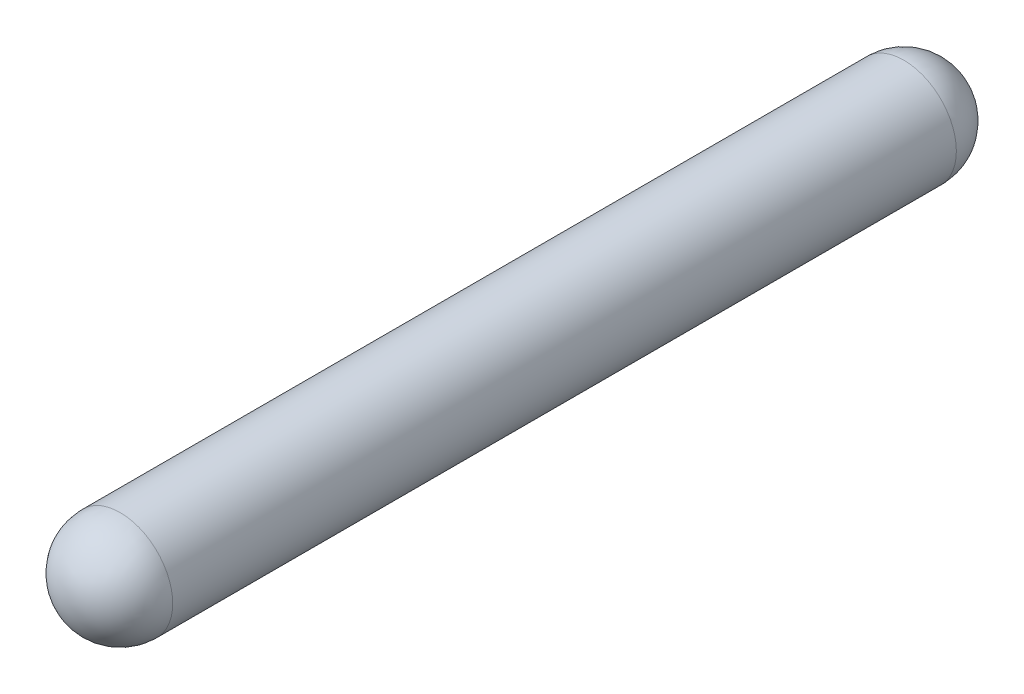
ISO-10303-21;
HEADER;
FILE_DESCRIPTION(('STEP AP214'),'2;1');
FILE_NAME('part.step','',(''),(''),'','','');
FILE_SCHEMA(('AUTOMOTIVE_DESIGN { 1 0 10303 214 1 1 1 1 }'));
ENDSEC;
DATA;
#1=APPLICATION_CONTEXT('core data for automotive mechanical design processes');
#2=APPLICATION_PROTOCOL_DEFINITION('international standard','automotive_design',2000,#1);
#3=PRODUCT_CONTEXT('',#1,'mechanical');
#4=PRODUCT('Part','Part','',(#3));
#5=PRODUCT_RELATED_PRODUCT_CATEGORY('part','',(#4));
#6=PRODUCT_DEFINITION_FORMATION('','',#4);
#7=PRODUCT_DEFINITION_CONTEXT('part definition',#1,'design');
#8=PRODUCT_DEFINITION('design','',#6,#7);
#9=PRODUCT_DEFINITION_SHAPE('','',#8);
#10=(LENGTH_UNIT() NAMED_UNIT(*) SI_UNIT(.MILLI.,.METRE.));
#11=(NAMED_UNIT(*) PLANE_ANGLE_UNIT() SI_UNIT($,.RADIAN.));
#12=(NAMED_UNIT(*) SI_UNIT($,.STERADIAN.) SOLID_ANGLE_UNIT());
#13=UNCERTAINTY_MEASURE_WITH_UNIT(LENGTH_MEASURE(1.E-05),#10,'distance_accuracy_value','');
#14=(GEOMETRIC_REPRESENTATION_CONTEXT(3) GLOBAL_UNCERTAINTY_ASSIGNED_CONTEXT((#13)) GLOBAL_UNIT_ASSIGNED_CONTEXT((#10,
#11,#12)) REPRESENTATION_CONTEXT('',''));
#15=CARTESIAN_POINT('',(0.,0.,0.));
#16=DIRECTION('',(0.,0.,1.));
#17=DIRECTION('',(1.,0.,0.));
#18=AXIS2_PLACEMENT_3D('',#15,#16,#17);
#19=CARTESIAN_POINT('',(-8.001,-11.811,-3.));
#20=DIRECTION('',(1.,0.,0.));
#21=DIRECTION('',(0.,-1.,0.));
#22=AXIS2_PLACEMENT_3D('',#19,#20,#21);
#23=SPHERICAL_SURFACE('',#22,0.7374);
#24=CARTESIAN_POINT('',(-8.001,-11.811,-3.));
#25=DIRECTION('',(0.,0.,1.));
#26=DIRECTION('',(1.,0.,0.));
#27=AXIS2_PLACEMENT_3D('',#24,#25,#26);
#28=CIRCLE('',#27,0.7374);
#29=CARTESIAN_POINT('',(-7.2636,-11.811,-3.));
#30=VERTEX_POINT('',#29);
#31=CARTESIAN_POINT('',(-8.7384,-11.811,-3.));
#32=VERTEX_POINT('',#31);
#33=EDGE_CURVE('E42',#30,#32,#28,.T.);
#34=ORIENTED_EDGE('',*,*,#33,.F.);
#35=CARTESIAN_POINT('',(-8.001,-11.811,-3.));
#36=DIRECTION('',(0.,0.,1.));
#37=DIRECTION('',(1.,0.,0.));
#38=AXIS2_PLACEMENT_3D('',#35,#36,#37);
#39=CIRCLE('',#38,0.7374);
#40=EDGE_CURVE('E26',#32,#30,#39,.T.);
#41=ORIENTED_EDGE('',*,*,#40,.F.);
#42=EDGE_LOOP('',(#34,#41));
#43=FACE_BOUND('',#42,.T.);
#44=ADVANCED_FACE('F17',(#43),#23,.T.);
#45=CARTESIAN_POINT('',(-8.001,-11.811,8.));
#46=DIRECTION('',(1.,0.,0.));
#47=DIRECTION('',(0.,1.,0.));
#48=AXIS2_PLACEMENT_3D('',#45,#46,#47);
#49=SPHERICAL_SURFACE('',#48,0.7374);
#50=CARTESIAN_POINT('',(-8.001,-11.811,8.));
#51=DIRECTION('',(0.,0.,1.));
#52=DIRECTION('',(1.,0.,0.));
#53=AXIS2_PLACEMENT_3D('',#50,#51,#52);
#54=CIRCLE('',#53,0.7374);
#55=CARTESIAN_POINT('',(-7.2636,-11.811,8.));
#56=VERTEX_POINT('',#55);
#57=CARTESIAN_POINT('',(-8.7384,-11.811,8.));
#58=VERTEX_POINT('',#57);
#59=EDGE_CURVE('E11',#56,#58,#54,.F.);
#60=ORIENTED_EDGE('',*,*,#59,.F.);
#61=CARTESIAN_POINT('',(-8.001,-11.811,8.));
#62=DIRECTION('',(0.,0.,1.));
#63=DIRECTION('',(1.,0.,0.));
#64=AXIS2_PLACEMENT_3D('',#61,#62,#63);
#65=CIRCLE('',#64,0.7374);
#66=EDGE_CURVE('E34',#58,#56,#65,.F.);
#67=ORIENTED_EDGE('',*,*,#66,.F.);
#68=EDGE_LOOP('',(#60,#67));
#69=FACE_BOUND('',#68,.T.);
#70=ADVANCED_FACE('F49',(#69),#49,.T.);
#71=CARTESIAN_POINT('',(-8.001,-11.811,-3.));
#72=DIRECTION('',(0.,0.,1.));
#73=DIRECTION('',(1.,0.,0.));
#74=AXIS2_PLACEMENT_3D('',#71,#72,#73);
#75=CYLINDRICAL_SURFACE('',#74,0.7374);
#76=ORIENTED_EDGE('',*,*,#66,.T.);
#77=ORIENTED_EDGE('',*,*,#59,.T.);
#78=EDGE_LOOP('',(#76,#77));
#79=FACE_BOUND('',#78,.T.);
#80=ORIENTED_EDGE('',*,*,#40,.T.);
#81=ORIENTED_EDGE('',*,*,#33,.T.);
#82=EDGE_LOOP('',(#80,#81));
#83=FACE_BOUND('',#82,.T.);
#84=ADVANCED_FACE('F45',(#79,#83),#75,.T.);
#85=CLOSED_SHELL('',(#44,#70,#84));
#86=MANIFOLD_SOLID_BREP('B1',#85);
#87=ADVANCED_BREP_SHAPE_REPRESENTATION('',(#18,#86),#14);
#88=SHAPE_DEFINITION_REPRESENTATION(#9,#87);
ENDSEC;
END-ISO-10303-21;
